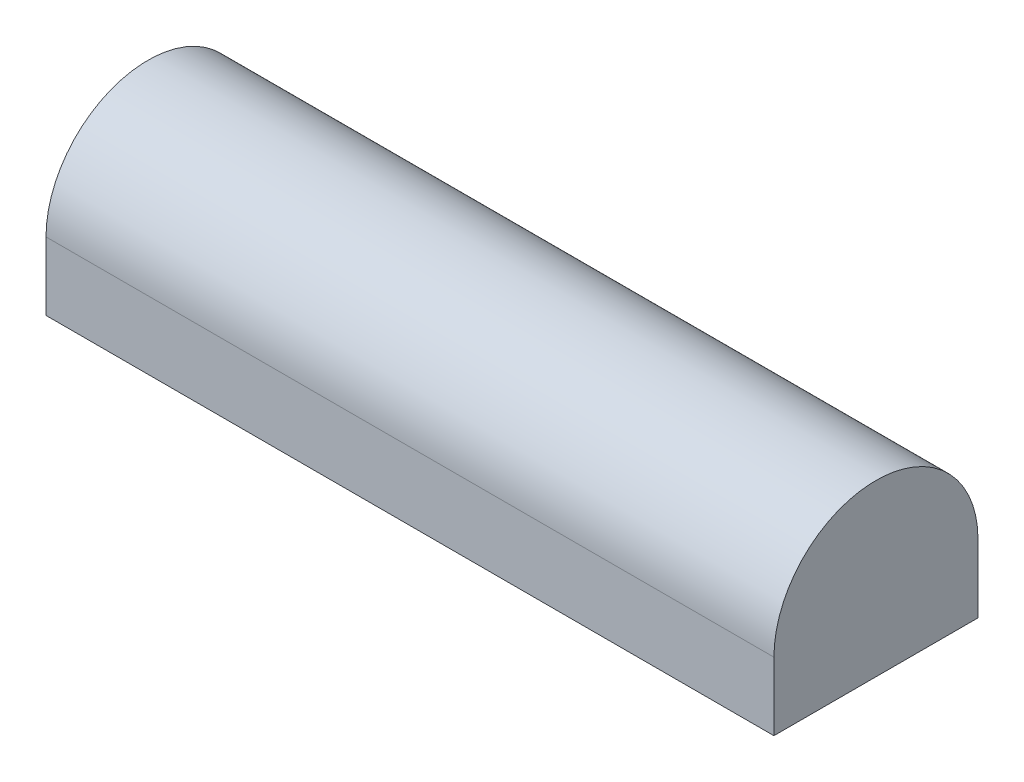
ISO-10303-21;
HEADER;
FILE_DESCRIPTION(('STEP AP214'),'2;1');
FILE_NAME('part.step','',(''),(''),'','','');
FILE_SCHEMA(('AUTOMOTIVE_DESIGN { 1 0 10303 214 1 1 1 1 }'));
ENDSEC;
DATA;
#1=APPLICATION_CONTEXT('core data for automotive mechanical design processes');
#2=APPLICATION_PROTOCOL_DEFINITION('international standard','automotive_design',2000,#1);
#3=PRODUCT_CONTEXT('',#1,'mechanical');
#4=PRODUCT('Part','Part','',(#3));
#5=PRODUCT_RELATED_PRODUCT_CATEGORY('part','',(#4));
#6=PRODUCT_DEFINITION_FORMATION('','',#4);
#7=PRODUCT_DEFINITION_CONTEXT('part definition',#1,'design');
#8=PRODUCT_DEFINITION('design','',#6,#7);
#9=PRODUCT_DEFINITION_SHAPE('','',#8);
#10=(LENGTH_UNIT() NAMED_UNIT(*) SI_UNIT(.MILLI.,.METRE.));
#11=(NAMED_UNIT(*) PLANE_ANGLE_UNIT() SI_UNIT($,.RADIAN.));
#12=(NAMED_UNIT(*) SI_UNIT($,.STERADIAN.) SOLID_ANGLE_UNIT());
#13=UNCERTAINTY_MEASURE_WITH_UNIT(LENGTH_MEASURE(1.E-05),#10,'distance_accuracy_value','');
#14=(GEOMETRIC_REPRESENTATION_CONTEXT(3) GLOBAL_UNCERTAINTY_ASSIGNED_CONTEXT((#13)) GLOBAL_UNIT_ASSIGNED_CONTEXT((#10,
#11,#12)) REPRESENTATION_CONTEXT('',''));
#15=CARTESIAN_POINT('',(0.,0.,0.));
#16=DIRECTION('',(0.,0.,1.));
#17=DIRECTION('',(1.,0.,0.));
#18=AXIS2_PLACEMENT_3D('',#15,#16,#17);
#19=CARTESIAN_POINT('',(10.7,0.,0.));
#20=DIRECTION('',(-1.,0.,0.));
#21=DIRECTION('',(0.,0.,1.));
#22=AXIS2_PLACEMENT_3D('',#19,#20,#21);
#23=CYLINDRICAL_SURFACE('',#22,1.5);
#24=CARTESIAN_POINT('',(0.,0.,0.));
#25=DIRECTION('',(1.,0.,0.));
#26=DIRECTION('',(0.,0.,-1.));
#27=AXIS2_PLACEMENT_3D('',#24,#25,#26);
#28=CIRCLE('',#27,1.5);
#29=CARTESIAN_POINT('',(0.,0.,1.5));
#30=VERTEX_POINT('',#29);
#31=CARTESIAN_POINT('',(0.,0.,-1.5));
#32=VERTEX_POINT('',#31);
#33=EDGE_CURVE('E99',#30,#32,#28,.F.);
#34=ORIENTED_EDGE('',*,*,#33,.F.);
#35=DIRECTION('',(-1.,0.,0.));
#36=VECTOR('',#35,1.);
#37=CARTESIAN_POINT('',(10.7,0.,1.5));
#38=LINE('',#37,#36);
#39=CARTESIAN_POINT('',(10.7,0.,1.5));
#40=VERTEX_POINT('',#39);
#41=EDGE_CURVE('E11',#40,#30,#38,.T.);
#42=ORIENTED_EDGE('',*,*,#41,.F.);
#43=CARTESIAN_POINT('',(10.7,0.,0.));
#44=DIRECTION('',(1.,0.,0.));
#45=DIRECTION('',(0.,0.,-1.));
#46=AXIS2_PLACEMENT_3D('',#43,#44,#45);
#47=CIRCLE('',#46,1.5);
#48=CARTESIAN_POINT('',(10.7,0.,-1.5));
#49=VERTEX_POINT('',#48);
#50=EDGE_CURVE('E87',#40,#49,#47,.F.);
#51=ORIENTED_EDGE('',*,*,#50,.T.);
#52=DIRECTION('',(-1.,0.,0.));
#53=VECTOR('',#52,1.);
#54=CARTESIAN_POINT('',(10.7,0.,-1.5));
#55=LINE('',#54,#53);
#56=EDGE_CURVE('E76',#49,#32,#55,.T.);
#57=ORIENTED_EDGE('',*,*,#56,.T.);
#58=EDGE_LOOP('',(#34,#42,#51,#57));
#59=FACE_BOUND('',#58,.T.);
#60=ADVANCED_FACE('F37',(#59),#23,.T.);
#61=CARTESIAN_POINT('',(10.7,0.,1.5));
#62=DIRECTION('',(0.,0.,-1.));
#63=DIRECTION('',(0.,1.,0.));
#64=AXIS2_PLACEMENT_3D('',#61,#62,#63);
#65=PLANE('',#64);
#66=DIRECTION('',(0.,-1.,0.));
#67=VECTOR('',#66,1.);
#68=CARTESIAN_POINT('',(0.,0.,1.5));
#69=LINE('',#68,#67);
#70=CARTESIAN_POINT('',(0.,-1.,1.5));
#71=VERTEX_POINT('',#70);
#72=EDGE_CURVE('E92',#30,#71,#69,.T.);
#73=ORIENTED_EDGE('',*,*,#72,.T.);
#74=DIRECTION('',(-1.,0.,0.));
#75=VECTOR('',#74,1.);
#76=CARTESIAN_POINT('',(10.7,-1.,1.5));
#77=LINE('',#76,#75);
#78=CARTESIAN_POINT('',(10.7,-1.,1.5));
#79=VERTEX_POINT('',#78);
#80=EDGE_CURVE('E45',#79,#71,#77,.T.);
#81=ORIENTED_EDGE('',*,*,#80,.F.);
#82=DIRECTION('',(0.,-1.,0.));
#83=VECTOR('',#82,1.);
#84=CARTESIAN_POINT('',(10.7,0.,1.5));
#85=LINE('',#84,#83);
#86=EDGE_CURVE('E82',#40,#79,#85,.T.);
#87=ORIENTED_EDGE('',*,*,#86,.F.);
#88=ORIENTED_EDGE('',*,*,#41,.T.);
#89=EDGE_LOOP('',(#73,#81,#87,#88));
#90=FACE_BOUND('',#89,.T.);
#91=ADVANCED_FACE('F90',(#90),#65,.F.);
#92=CARTESIAN_POINT('',(10.7,-1.,0.));
#93=DIRECTION('',(0.,1.,0.));
#94=DIRECTION('',(0.,0.,1.));
#95=AXIS2_PLACEMENT_3D('',#92,#93,#94);
#96=PLANE('',#95);
#97=DIRECTION('',(0.,0.,-1.));
#98=VECTOR('',#97,1.);
#99=CARTESIAN_POINT('',(0.,-1.,0.));
#100=LINE('',#99,#98);
#101=CARTESIAN_POINT('',(0.,-1.,-1.5));
#102=VERTEX_POINT('',#101);
#103=EDGE_CURVE('E69',#71,#102,#100,.T.);
#104=ORIENTED_EDGE('',*,*,#103,.T.);
#105=DIRECTION('',(-1.,0.,0.));
#106=VECTOR('',#105,1.);
#107=CARTESIAN_POINT('',(10.7,-1.,-1.5));
#108=LINE('',#107,#106);
#109=CARTESIAN_POINT('',(10.7,-1.,-1.5));
#110=VERTEX_POINT('',#109);
#111=EDGE_CURVE('E93',#110,#102,#108,.T.);
#112=ORIENTED_EDGE('',*,*,#111,.F.);
#113=DIRECTION('',(0.,0.,-1.));
#114=VECTOR('',#113,1.);
#115=CARTESIAN_POINT('',(10.7,-1.,0.));
#116=LINE('',#115,#114);
#117=EDGE_CURVE('E86',#79,#110,#116,.T.);
#118=ORIENTED_EDGE('',*,*,#117,.F.);
#119=ORIENTED_EDGE('',*,*,#80,.T.);
#120=EDGE_LOOP('',(#104,#112,#118,#119));
#121=FACE_BOUND('',#120,.T.);
#122=ADVANCED_FACE('F94',(#121),#96,.F.);
#123=CARTESIAN_POINT('',(10.7,0.,-1.5));
#124=DIRECTION('',(0.,0.,1.));
#125=DIRECTION('',(1.,0.,0.));
#126=AXIS2_PLACEMENT_3D('',#123,#124,#125);
#127=PLANE('',#126);
#128=DIRECTION('',(0.,1.,0.));
#129=VECTOR('',#128,1.);
#130=CARTESIAN_POINT('',(0.,0.,-1.5));
#131=LINE('',#130,#129);
#132=EDGE_CURVE('E104',#102,#32,#131,.T.);
#133=ORIENTED_EDGE('',*,*,#132,.T.);
#134=ORIENTED_EDGE('',*,*,#56,.F.);
#135=DIRECTION('',(0.,1.,0.));
#136=VECTOR('',#135,1.);
#137=CARTESIAN_POINT('',(10.7,0.,-1.5));
#138=LINE('',#137,#136);
#139=EDGE_CURVE('E53',#110,#49,#138,.T.);
#140=ORIENTED_EDGE('',*,*,#139,.F.);
#141=ORIENTED_EDGE('',*,*,#111,.T.);
#142=EDGE_LOOP('',(#133,#134,#140,#141));
#143=FACE_BOUND('',#142,.T.);
#144=ADVANCED_FACE('F109',(#143),#127,.F.);
#145=CARTESIAN_POINT('',(10.7,0.,0.));
#146=DIRECTION('',(1.,0.,0.));
#147=DIRECTION('',(0.,0.,-1.));
#148=AXIS2_PLACEMENT_3D('',#145,#146,#147);
#149=PLANE('',#148);
#150=ORIENTED_EDGE('',*,*,#50,.F.);
#151=ORIENTED_EDGE('',*,*,#86,.T.);
#152=ORIENTED_EDGE('',*,*,#117,.T.);
#153=ORIENTED_EDGE('',*,*,#139,.T.);
#154=EDGE_LOOP('',(#150,#151,#152,#153));
#155=FACE_BOUND('',#154,.T.);
#156=ADVANCED_FACE('F84',(#155),#149,.T.);
#157=CARTESIAN_POINT('',(0.,0.,0.));
#158=DIRECTION('',(1.,0.,0.));
#159=DIRECTION('',(0.,0.,-1.));
#160=AXIS2_PLACEMENT_3D('',#157,#158,#159);
#161=PLANE('',#160);
#162=ORIENTED_EDGE('',*,*,#33,.T.);
#163=ORIENTED_EDGE('',*,*,#132,.F.);
#164=ORIENTED_EDGE('',*,*,#103,.F.);
#165=ORIENTED_EDGE('',*,*,#72,.F.);
#166=EDGE_LOOP('',(#162,#163,#164,#165));
#167=FACE_BOUND('',#166,.T.);
#168=ADVANCED_FACE('F111',(#167),#161,.F.);
#169=CLOSED_SHELL('',(#60,#91,#122,#144,#156,#168));
#170=MANIFOLD_SOLID_BREP('B2',#169);
#171=ADVANCED_BREP_SHAPE_REPRESENTATION('',(#18,#170),#14);
#172=SHAPE_DEFINITION_REPRESENTATION(#9,#171);
ENDSEC;
END-ISO-10303-21;
